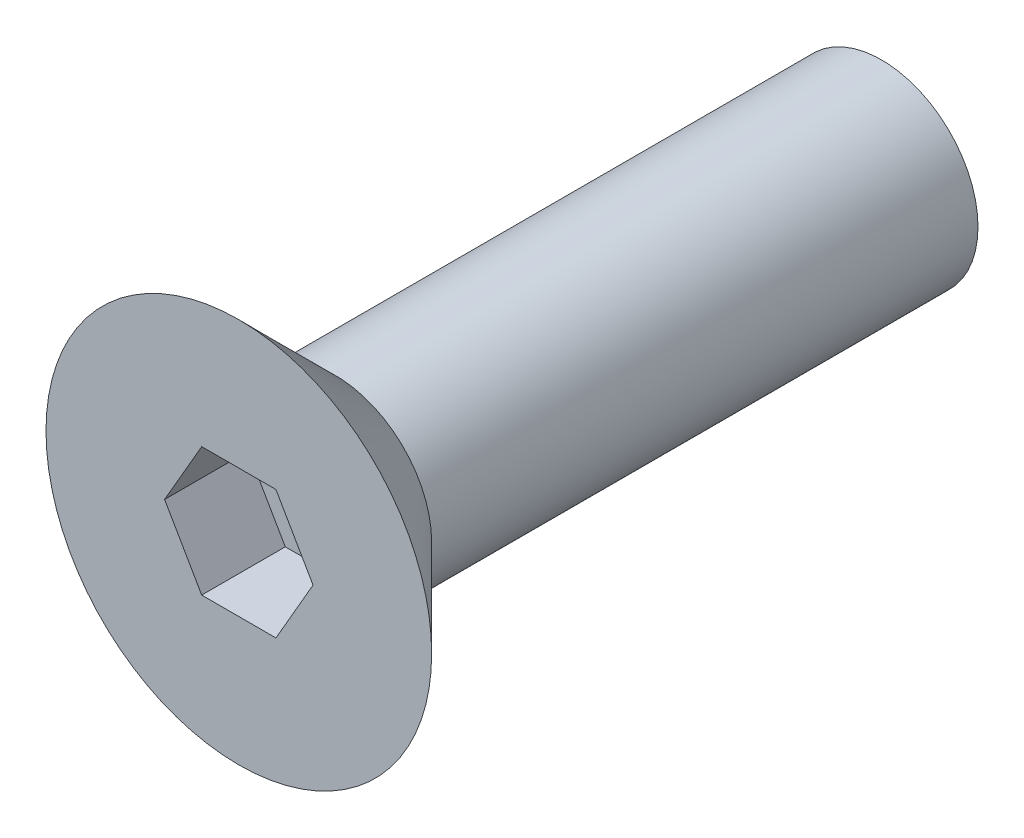
ISO-10303-21;
HEADER;
FILE_DESCRIPTION(('STEP AP214'),'2;1');
FILE_NAME('part.step','',(''),(''),'','','');
FILE_SCHEMA(('AUTOMOTIVE_DESIGN { 1 0 10303 214 1 1 1 1 }'));
ENDSEC;
DATA;
#1=APPLICATION_CONTEXT('core data for automotive mechanical design processes');
#2=APPLICATION_PROTOCOL_DEFINITION('international standard','automotive_design',2000,#1);
#3=PRODUCT_CONTEXT('',#1,'mechanical');
#4=PRODUCT('Part','Part','',(#3));
#5=PRODUCT_RELATED_PRODUCT_CATEGORY('part','',(#4));
#6=PRODUCT_DEFINITION_FORMATION('','',#4);
#7=PRODUCT_DEFINITION_CONTEXT('part definition',#1,'design');
#8=PRODUCT_DEFINITION('design','',#6,#7);
#9=PRODUCT_DEFINITION_SHAPE('','',#8);
#10=(LENGTH_UNIT() NAMED_UNIT(*) SI_UNIT(.MILLI.,.METRE.));
#11=(NAMED_UNIT(*) PLANE_ANGLE_UNIT() SI_UNIT($,.RADIAN.));
#12=(NAMED_UNIT(*) SI_UNIT($,.STERADIAN.) SOLID_ANGLE_UNIT());
#13=UNCERTAINTY_MEASURE_WITH_UNIT(LENGTH_MEASURE(1.E-05),#10,'distance_accuracy_value','');
#14=(GEOMETRIC_REPRESENTATION_CONTEXT(3) GLOBAL_UNCERTAINTY_ASSIGNED_CONTEXT((#13)) GLOBAL_UNIT_ASSIGNED_CONTEXT((#10,
#11,#12)) REPRESENTATION_CONTEXT('',''));
#15=CARTESIAN_POINT('',(0.,0.,0.));
#16=DIRECTION('',(0.,0.,1.));
#17=DIRECTION('',(1.,0.,0.));
#18=AXIS2_PLACEMENT_3D('',#15,#16,#17);
#19=CARTESIAN_POINT('',(0.,0.,-1.3));
#20=DIRECTION('',(0.,0.,1.));
#21=DIRECTION('',(1.,0.,0.));
#22=AXIS2_PLACEMENT_3D('',#19,#20,#21);
#23=PLANE('',#22);
#24=DIRECTION('',(-0.50000000000019,0.866025403784329,0.));
#25=VECTOR('',#24,1.);
#26=CARTESIAN_POINT('',(1.154700538379,0.,-1.3));
#27=LINE('',#26,#25);
#28=CARTESIAN_POINT('',(1.154700538379,0.,-1.3));
#29=VERTEX_POINT('',#28);
#30=CARTESIAN_POINT('',(0.57735026919,1.,-1.3));
#31=VERTEX_POINT('',#30);
#32=EDGE_CURVE('E10',#29,#31,#27,.T.);
#33=ORIENTED_EDGE('',*,*,#32,.T.);
#34=DIRECTION('',(-1.,0.,0.));
#35=VECTOR('',#34,1.);
#36=CARTESIAN_POINT('',(0.57735026919,1.,-1.3));
#37=LINE('',#36,#35);
#38=CARTESIAN_POINT('',(-0.57735026919,1.,-1.3));
#39=VERTEX_POINT('',#38);
#40=EDGE_CURVE('E103',#31,#39,#37,.T.);
#41=ORIENTED_EDGE('',*,*,#40,.T.);
#42=DIRECTION('',(-0.50000000000019,-0.866025403784329,0.));
#43=VECTOR('',#42,1.);
#44=CARTESIAN_POINT('',(-0.57735026919,1.,-1.3));
#45=LINE('',#44,#43);
#46=CARTESIAN_POINT('',(-1.154700538379,0.,-1.3));
#47=VERTEX_POINT('',#46);
#48=EDGE_CURVE('E101',#39,#47,#45,.T.);
#49=ORIENTED_EDGE('',*,*,#48,.T.);
#50=DIRECTION('',(0.50000000000019,-0.866025403784329,0.));
#51=VECTOR('',#50,1.);
#52=CARTESIAN_POINT('',(-1.154700538379,0.,-1.3));
#53=LINE('',#52,#51);
#54=CARTESIAN_POINT('',(-0.57735026919,-1.,-1.3));
#55=VERTEX_POINT('',#54);
#56=EDGE_CURVE('E97',#47,#55,#53,.T.);
#57=ORIENTED_EDGE('',*,*,#56,.T.);
#58=DIRECTION('',(1.,0.,0.));
#59=VECTOR('',#58,1.);
#60=CARTESIAN_POINT('',(-0.57735026919,-1.,-1.3));
#61=LINE('',#60,#59);
#62=CARTESIAN_POINT('',(0.57735026919,-1.,-1.3));
#63=VERTEX_POINT('',#62);
#64=EDGE_CURVE('E19',#55,#63,#61,.T.);
#65=ORIENTED_EDGE('',*,*,#64,.T.);
#66=DIRECTION('',(0.50000000000019,0.866025403784329,0.));
#67=VECTOR('',#66,1.);
#68=CARTESIAN_POINT('',(0.57735026919,-1.,-1.3));
#69=LINE('',#68,#67);
#70=EDGE_CURVE('E131',#63,#29,#69,.T.);
#71=ORIENTED_EDGE('',*,*,#70,.T.);
#72=EDGE_LOOP('',(#33,#41,#49,#57,#65,#71));
#73=FACE_BOUND('',#72,.T.);
#74=ADVANCED_FACE('F15',(#73),#23,.T.);
#75=CARTESIAN_POINT('',(1.154700538379,0.,-1.3));
#76=DIRECTION('',(-0.866025403784329,-0.50000000000019,0.));
#77=DIRECTION('',(-0.50000000000019,0.866025403784329,0.));
#78=AXIS2_PLACEMENT_3D('',#75,#76,#77);
#79=PLANE('',#78);
#80=ORIENTED_EDGE('',*,*,#32,.F.);
#81=DIRECTION('',(0.,0.,1.));
#82=VECTOR('',#81,1.);
#83=CARTESIAN_POINT('',(1.154700538379,0.,-1.3));
#84=LINE('',#83,#82);
#85=CARTESIAN_POINT('',(1.154700538379,0.,0.));
#86=VERTEX_POINT('',#85);
#87=EDGE_CURVE('E72',#29,#86,#84,.T.);
#88=ORIENTED_EDGE('',*,*,#87,.T.);
#89=DIRECTION('',(-0.50000000000019,0.866025403784329,0.));
#90=VECTOR('',#89,1.);
#91=CARTESIAN_POINT('',(1.010362971082,0.25,0.));
#92=LINE('',#91,#90);
#93=CARTESIAN_POINT('',(0.57735026919,1.,0.));
#94=VERTEX_POINT('',#93);
#95=EDGE_CURVE('E140',#86,#94,#92,.T.);
#96=ORIENTED_EDGE('',*,*,#95,.T.);
#97=DIRECTION('',(0.,0.,1.));
#98=VECTOR('',#97,1.);
#99=CARTESIAN_POINT('',(0.57735026919,1.,-1.3));
#100=LINE('',#99,#98);
#101=EDGE_CURVE('E26',#31,#94,#100,.T.);
#102=ORIENTED_EDGE('',*,*,#101,.F.);
#103=EDGE_LOOP('',(#80,#88,#96,#102));
#104=FACE_BOUND('',#103,.T.);
#105=ADVANCED_FACE('F205',(#104),#79,.T.);
#106=CARTESIAN_POINT('',(0.57735026919,1.,-1.3));
#107=DIRECTION('',(0.,-1.,0.));
#108=DIRECTION('',(-1.,0.,0.));
#109=AXIS2_PLACEMENT_3D('',#106,#107,#108);
#110=PLANE('',#109);
#111=ORIENTED_EDGE('',*,*,#40,.F.);
#112=ORIENTED_EDGE('',*,*,#101,.T.);
#113=DIRECTION('',(-1.,0.,0.));
#114=VECTOR('',#113,1.);
#115=CARTESIAN_POINT('',(0.288675134595,1.,0.));
#116=LINE('',#115,#114);
#117=CARTESIAN_POINT('',(-0.57735026919,1.,0.));
#118=VERTEX_POINT('',#117);
#119=EDGE_CURVE('E144',#94,#118,#116,.T.);
#120=ORIENTED_EDGE('',*,*,#119,.T.);
#121=DIRECTION('',(0.,0.,1.));
#122=VECTOR('',#121,1.);
#123=CARTESIAN_POINT('',(-0.57735026919,1.,-1.3));
#124=LINE('',#123,#122);
#125=EDGE_CURVE('E107',#39,#118,#124,.T.);
#126=ORIENTED_EDGE('',*,*,#125,.F.);
#127=EDGE_LOOP('',(#111,#112,#120,#126));
#128=FACE_BOUND('',#127,.T.);
#129=ADVANCED_FACE('F210',(#128),#110,.T.);
#130=CARTESIAN_POINT('',(-0.57735026919,1.,-1.3));
#131=DIRECTION('',(0.866025403784329,-0.50000000000019,0.));
#132=DIRECTION('',(0.,0.,-1.));
#133=AXIS2_PLACEMENT_3D('',#130,#131,#132);
#134=PLANE('',#133);
#135=ORIENTED_EDGE('',*,*,#48,.F.);
#136=ORIENTED_EDGE('',*,*,#125,.T.);
#137=DIRECTION('',(-0.50000000000019,-0.866025403784329,0.));
#138=VECTOR('',#137,1.);
#139=CARTESIAN_POINT('',(-0.721687836487,0.75,0.));
#140=LINE('',#139,#138);
#141=CARTESIAN_POINT('',(-1.154700538379,0.,0.));
#142=VERTEX_POINT('',#141);
#143=EDGE_CURVE('E113',#118,#142,#140,.T.);
#144=ORIENTED_EDGE('',*,*,#143,.T.);
#145=DIRECTION('',(0.,0.,1.));
#146=VECTOR('',#145,1.);
#147=CARTESIAN_POINT('',(-1.154700538379,0.,-1.3));
#148=LINE('',#147,#146);
#149=EDGE_CURVE('E108',#47,#142,#148,.T.);
#150=ORIENTED_EDGE('',*,*,#149,.F.);
#151=EDGE_LOOP('',(#135,#136,#144,#150));
#152=FACE_BOUND('',#151,.T.);
#153=ADVANCED_FACE('F111',(#152),#134,.T.);
#154=CARTESIAN_POINT('',(-1.154700538379,0.,-1.3));
#155=DIRECTION('',(0.866025403784329,0.50000000000019,0.));
#156=DIRECTION('',(0.,0.,-1.));
#157=AXIS2_PLACEMENT_3D('',#154,#155,#156);
#158=PLANE('',#157);
#159=ORIENTED_EDGE('',*,*,#56,.F.);
#160=ORIENTED_EDGE('',*,*,#149,.T.);
#161=DIRECTION('',(0.50000000000019,-0.866025403784329,0.));
#162=VECTOR('',#161,1.);
#163=CARTESIAN_POINT('',(-1.010362971082,-0.25,0.));
#164=LINE('',#163,#162);
#165=CARTESIAN_POINT('',(-0.57735026919,-1.,0.));
#166=VERTEX_POINT('',#165);
#167=EDGE_CURVE('E155',#142,#166,#164,.T.);
#168=ORIENTED_EDGE('',*,*,#167,.T.);
#169=DIRECTION('',(0.,0.,1.));
#170=VECTOR('',#169,1.);
#171=CARTESIAN_POINT('',(-0.57735026919,-1.,-1.3));
#172=LINE('',#171,#170);
#173=EDGE_CURVE('E120',#55,#166,#172,.T.);
#174=ORIENTED_EDGE('',*,*,#173,.F.);
#175=EDGE_LOOP('',(#159,#160,#168,#174));
#176=FACE_BOUND('',#175,.T.);
#177=ADVANCED_FACE('F119',(#176),#158,.T.);
#178=CARTESIAN_POINT('',(-0.57735026919,-1.,-1.3));
#179=DIRECTION('',(0.,1.,0.));
#180=DIRECTION('',(1.,0.,0.));
#181=AXIS2_PLACEMENT_3D('',#178,#179,#180);
#182=PLANE('',#181);
#183=ORIENTED_EDGE('',*,*,#64,.F.);
#184=ORIENTED_EDGE('',*,*,#173,.T.);
#185=DIRECTION('',(1.,0.,0.));
#186=VECTOR('',#185,1.);
#187=CARTESIAN_POINT('',(-0.288675134595,-1.,0.));
#188=LINE('',#187,#186);
#189=CARTESIAN_POINT('',(0.57735026919,-1.,0.));
#190=VERTEX_POINT('',#189);
#191=EDGE_CURVE('E134',#166,#190,#188,.T.);
#192=ORIENTED_EDGE('',*,*,#191,.T.);
#193=DIRECTION('',(0.,0.,1.));
#194=VECTOR('',#193,1.);
#195=CARTESIAN_POINT('',(0.57735026919,-1.,-1.3));
#196=LINE('',#195,#194);
#197=EDGE_CURVE('E149',#63,#190,#196,.T.);
#198=ORIENTED_EDGE('',*,*,#197,.F.);
#199=EDGE_LOOP('',(#183,#184,#192,#198));
#200=FACE_BOUND('',#199,.T.);
#201=ADVANCED_FACE('F199',(#200),#182,.T.);
#202=CARTESIAN_POINT('',(0.57735026919,-1.,-1.3));
#203=DIRECTION('',(-0.866025403784329,0.50000000000019,0.));
#204=DIRECTION('',(0.,0.,1.));
#205=AXIS2_PLACEMENT_3D('',#202,#203,#204);
#206=PLANE('',#205);
#207=ORIENTED_EDGE('',*,*,#70,.F.);
#208=ORIENTED_EDGE('',*,*,#197,.T.);
#209=DIRECTION('',(0.50000000000019,0.866025403784329,0.));
#210=VECTOR('',#209,1.);
#211=CARTESIAN_POINT('',(0.721687836487,-0.75,0.));
#212=LINE('',#211,#210);
#213=EDGE_CURVE('E143',#190,#86,#212,.T.);
#214=ORIENTED_EDGE('',*,*,#213,.T.);
#215=ORIENTED_EDGE('',*,*,#87,.F.);
#216=EDGE_LOOP('',(#207,#208,#214,#215));
#217=FACE_BOUND('',#216,.T.);
#218=ADVANCED_FACE('F191',(#217),#206,.T.);
#219=CARTESIAN_POINT('',(0.,0.,-10.));
#220=DIRECTION('',(0.,0.,-1.));
#221=DIRECTION('',(0.,-1.,0.));
#222=AXIS2_PLACEMENT_3D('',#219,#220,#221);
#223=PLANE('',#222);
#224=CARTESIAN_POINT('',(0.,0.,-10.));
#225=DIRECTION('',(0.,0.,-1.));
#226=DIRECTION('',(-1.,0.,0.));
#227=AXIS2_PLACEMENT_3D('',#224,#225,#226);
#228=CIRCLE('',#227,1.5);
#229=CARTESIAN_POINT('',(-1.5,0.,-10.));
#230=VERTEX_POINT('',#229);
#231=EDGE_CURVE('E132',#230,#230,#228,.T.);
#232=ORIENTED_EDGE('',*,*,#231,.T.);
#233=EDGE_LOOP('',(#232));
#234=FACE_BOUND('',#233,.T.);
#235=ADVANCED_FACE('F189',(#234),#223,.T.);
#236=CARTESIAN_POINT('',(0.,0.,0.));
#237=DIRECTION('',(0.,0.,-1.));
#238=DIRECTION('',(0.,-1.,0.));
#239=AXIS2_PLACEMENT_3D('',#236,#237,#238);
#240=PLANE('',#239);
#241=ORIENTED_EDGE('',*,*,#191,.F.);
#242=ORIENTED_EDGE('',*,*,#167,.F.);
#243=ORIENTED_EDGE('',*,*,#143,.F.);
#244=ORIENTED_EDGE('',*,*,#119,.F.);
#245=ORIENTED_EDGE('',*,*,#95,.F.);
#246=ORIENTED_EDGE('',*,*,#213,.F.);
#247=EDGE_LOOP('',(#241,#242,#243,#244,#245,#246));
#248=FACE_BOUND('',#247,.T.);
#249=CARTESIAN_POINT('',(0.,0.,0.));
#250=DIRECTION('',(0.,0.,-1.));
#251=DIRECTION('',(-1.,0.,0.));
#252=AXIS2_PLACEMENT_3D('',#249,#250,#251);
#253=CIRCLE('',#252,3.);
#254=CARTESIAN_POINT('',(-3.,0.,0.));
#255=VERTEX_POINT('',#254);
#256=EDGE_CURVE('E139',#255,#255,#253,.T.);
#257=ORIENTED_EDGE('',*,*,#256,.F.);
#258=EDGE_LOOP('',(#257));
#259=FACE_BOUND('',#258,.T.);
#260=ADVANCED_FACE('F17',(#248,#259),#240,.F.);
#261=CARTESIAN_POINT('',(0.,0.,0.));
#262=DIRECTION('',(0.,0.,-1.));
#263=DIRECTION('',(-1.,0.,0.));
#264=AXIS2_PLACEMENT_3D('',#261,#262,#263);
#265=CYLINDRICAL_SURFACE('',#264,1.5);
#266=DIRECTION('',(0.,0.,-1.));
#267=VECTOR('',#266,1.);
#268=CARTESIAN_POINT('',(-1.5,0.,0.));
#269=LINE('',#268,#267);
#270=CARTESIAN_POINT('',(-1.5,0.,-1.5));
#271=VERTEX_POINT('',#270);
#272=EDGE_CURVE('E135',#271,#230,#269,.T.);
#273=ORIENTED_EDGE('',*,*,#272,.T.);
#274=ORIENTED_EDGE('',*,*,#231,.F.);
#275=ORIENTED_EDGE('',*,*,#272,.F.);
#276=CARTESIAN_POINT('',(0.,0.,-1.5));
#277=DIRECTION('',(0.,0.,-1.));
#278=DIRECTION('',(-1.,0.,0.));
#279=AXIS2_PLACEMENT_3D('',#276,#277,#278);
#280=CIRCLE('',#279,1.5);
#281=EDGE_CURVE('E162',#271,#271,#280,.T.);
#282=ORIENTED_EDGE('',*,*,#281,.T.);
#283=EDGE_LOOP('',(#273,#274,#275,#282));
#284=FACE_BOUND('',#283,.T.);
#285=ADVANCED_FACE('F186',(#284),#265,.T.);
#286=CARTESIAN_POINT('',(0.,0.,0.));
#287=DIRECTION('',(0.,0.,1.));
#288=DIRECTION('',(-1.,0.,0.));
#289=AXIS2_PLACEMENT_3D('',#286,#287,#288);
#290=CONICAL_SURFACE('',#289,3.,0.785398163397);
#291=ORIENTED_EDGE('',*,*,#281,.F.);
#292=DIRECTION('',(0.707106781186548,0.,-0.707106781186548));
#293=VECTOR('',#292,1.);
#294=CARTESIAN_POINT('',(-3.,0.,0.));
#295=LINE('',#294,#293);
#296=EDGE_CURVE('E166',#255,#271,#295,.T.);
#297=ORIENTED_EDGE('',*,*,#296,.F.);
#298=ORIENTED_EDGE('',*,*,#256,.T.);
#299=ORIENTED_EDGE('',*,*,#296,.T.);
#300=EDGE_LOOP('',(#291,#297,#298,#299));
#301=FACE_BOUND('',#300,.T.);
#302=ADVANCED_FACE('F182',(#301),#290,.T.);
#303=CLOSED_SHELL('',(#74,#105,#129,#153,#177,#201,#218,#235,#260,#285,#302));
#304=MANIFOLD_SOLID_BREP('B1',#303);
#305=ADVANCED_BREP_SHAPE_REPRESENTATION('',(#18,#304),#14);
#306=SHAPE_DEFINITION_REPRESENTATION(#9,#305);
ENDSEC;
END-ISO-10303-21;
